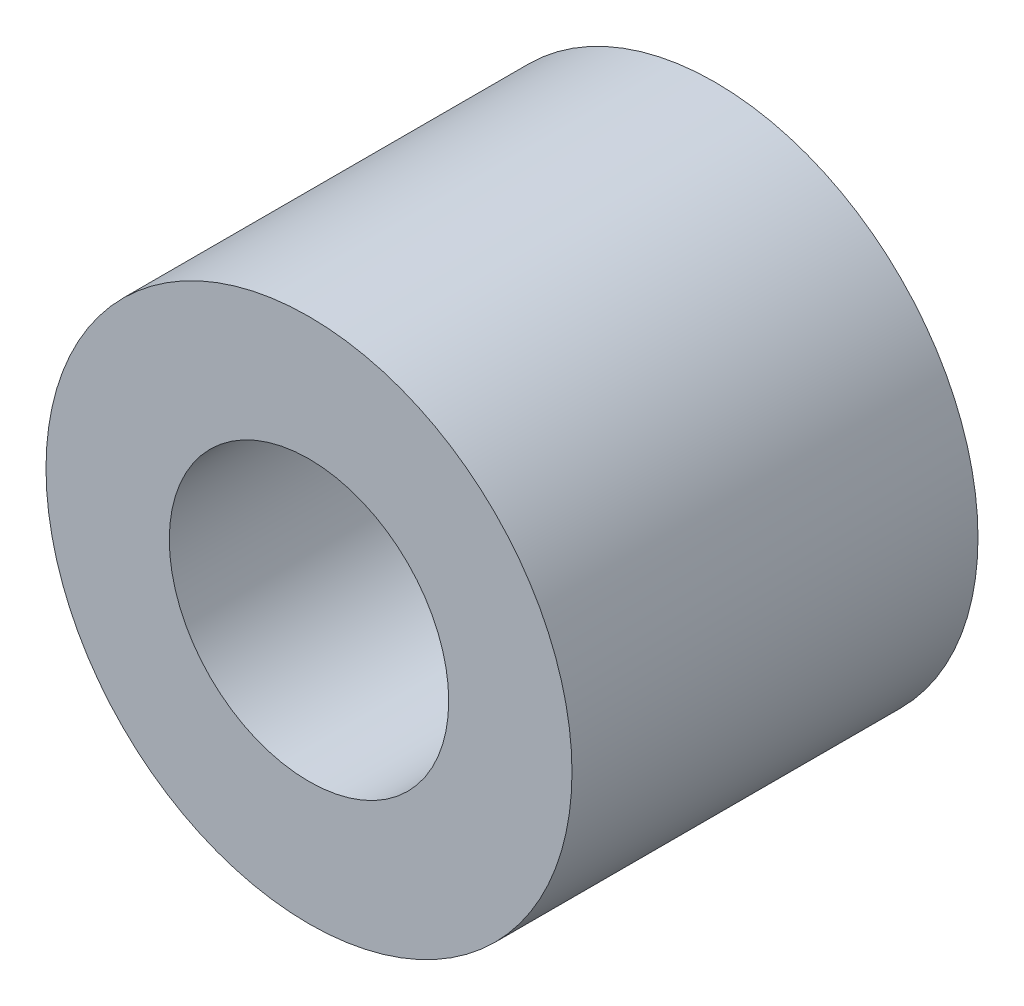
ISO-10303-21;
HEADER;
FILE_DESCRIPTION(('STEP AP214'),'2;1');
FILE_NAME('part.step','',(''),(''),'','','');
FILE_SCHEMA(('AUTOMOTIVE_DESIGN { 1 0 10303 214 1 1 1 1 }'));
ENDSEC;
DATA;
#1=APPLICATION_CONTEXT('core data for automotive mechanical design processes');
#2=APPLICATION_PROTOCOL_DEFINITION('international standard','automotive_design',2000,#1);
#3=PRODUCT_CONTEXT('',#1,'mechanical');
#4=PRODUCT('Part','Part','',(#3));
#5=PRODUCT_RELATED_PRODUCT_CATEGORY('part','',(#4));
#6=PRODUCT_DEFINITION_FORMATION('','',#4);
#7=PRODUCT_DEFINITION_CONTEXT('part definition',#1,'design');
#8=PRODUCT_DEFINITION('design','',#6,#7);
#9=PRODUCT_DEFINITION_SHAPE('','',#8);
#10=(LENGTH_UNIT() NAMED_UNIT(*) SI_UNIT(.MILLI.,.METRE.));
#11=(NAMED_UNIT(*) PLANE_ANGLE_UNIT() SI_UNIT($,.RADIAN.));
#12=(NAMED_UNIT(*) SI_UNIT($,.STERADIAN.) SOLID_ANGLE_UNIT());
#13=UNCERTAINTY_MEASURE_WITH_UNIT(LENGTH_MEASURE(1.E-05),#10,'distance_accuracy_value','');
#14=(GEOMETRIC_REPRESENTATION_CONTEXT(3) GLOBAL_UNCERTAINTY_ASSIGNED_CONTEXT((#13)) GLOBAL_UNIT_ASSIGNED_CONTEXT((#10,
#11,#12)) REPRESENTATION_CONTEXT('',''));
#15=CARTESIAN_POINT('',(0.,0.,0.));
#16=DIRECTION('',(0.,0.,1.));
#17=DIRECTION('',(1.,0.,0.));
#18=AXIS2_PLACEMENT_3D('',#15,#16,#17);
#19=CARTESIAN_POINT('',(0.,0.,12.35));
#20=DIRECTION('',(0.,0.,1.));
#21=DIRECTION('',(1.,0.,0.));
#22=AXIS2_PLACEMENT_3D('',#19,#20,#21);
#23=PLANE('',#22);
#24=CARTESIAN_POINT('',(0.,0.,12.35));
#25=DIRECTION('',(0.,0.,1.));
#26=DIRECTION('',(1.,0.,0.));
#27=AXIS2_PLACEMENT_3D('',#24,#25,#26);
#28=CIRCLE('',#27,8.);
#29=CARTESIAN_POINT('',(8.,0.,12.35));
#30=VERTEX_POINT('',#29);
#31=EDGE_CURVE('E10',#30,#30,#28,.T.);
#32=ORIENTED_EDGE('',*,*,#31,.T.);
#33=EDGE_LOOP('',(#32));
#34=FACE_BOUND('',#33,.T.);
#35=CARTESIAN_POINT('',(0.,0.,12.35));
#36=DIRECTION('',(0.,0.,1.));
#37=DIRECTION('',(1.,0.,0.));
#38=AXIS2_PLACEMENT_3D('',#35,#36,#37);
#39=CIRCLE('',#38,4.25);
#40=CARTESIAN_POINT('',(4.25,0.,12.35));
#41=VERTEX_POINT('',#40);
#42=EDGE_CURVE('E44',#41,#41,#39,.T.);
#43=ORIENTED_EDGE('',*,*,#42,.F.);
#44=EDGE_LOOP('',(#43));
#45=FACE_BOUND('',#44,.T.);
#46=ADVANCED_FACE('F33',(#34,#45),#23,.T.);
#47=CARTESIAN_POINT('',(0.,0.,0.));
#48=DIRECTION('',(0.,0.,1.));
#49=DIRECTION('',(1.,0.,0.));
#50=AXIS2_PLACEMENT_3D('',#47,#48,#49);
#51=PLANE('',#50);
#52=CARTESIAN_POINT('',(0.,0.,0.));
#53=DIRECTION('',(0.,0.,1.));
#54=DIRECTION('',(1.,0.,0.));
#55=AXIS2_PLACEMENT_3D('',#52,#53,#54);
#56=CIRCLE('',#55,8.);
#57=CARTESIAN_POINT('',(8.,0.,0.));
#58=VERTEX_POINT('',#57);
#59=EDGE_CURVE('E37',#58,#58,#56,.T.);
#60=ORIENTED_EDGE('',*,*,#59,.F.);
#61=EDGE_LOOP('',(#60));
#62=FACE_BOUND('',#61,.T.);
#63=CARTESIAN_POINT('',(0.,0.,0.));
#64=DIRECTION('',(0.,0.,1.));
#65=DIRECTION('',(1.,0.,0.));
#66=AXIS2_PLACEMENT_3D('',#63,#64,#65);
#67=CIRCLE('',#66,4.25);
#68=CARTESIAN_POINT('',(4.25,0.,0.));
#69=VERTEX_POINT('',#68);
#70=EDGE_CURVE('E46',#69,#69,#67,.T.);
#71=ORIENTED_EDGE('',*,*,#70,.T.);
#72=EDGE_LOOP('',(#71));
#73=FACE_BOUND('',#72,.T.);
#74=ADVANCED_FACE('F56',(#62,#73),#51,.F.);
#75=CARTESIAN_POINT('',(0.,0.,12.35));
#76=DIRECTION('',(0.,0.,-1.));
#77=DIRECTION('',(-1.,0.,0.));
#78=AXIS2_PLACEMENT_3D('',#75,#76,#77);
#79=CYLINDRICAL_SURFACE('',#78,8.);
#80=ORIENTED_EDGE('',*,*,#31,.F.);
#81=EDGE_LOOP('',(#80));
#82=FACE_BOUND('',#81,.T.);
#83=ORIENTED_EDGE('',*,*,#59,.T.);
#84=EDGE_LOOP('',(#83));
#85=FACE_BOUND('',#84,.T.);
#86=ADVANCED_FACE('F35',(#82,#85),#79,.T.);
#87=CARTESIAN_POINT('',(0.,0.,12.35));
#88=DIRECTION('',(0.,0.,-1.));
#89=DIRECTION('',(-1.,0.,0.));
#90=AXIS2_PLACEMENT_3D('',#87,#88,#89);
#91=CYLINDRICAL_SURFACE('',#90,4.25);
#92=ORIENTED_EDGE('',*,*,#42,.T.);
#93=EDGE_LOOP('',(#92));
#94=FACE_BOUND('',#93,.T.);
#95=ORIENTED_EDGE('',*,*,#70,.F.);
#96=EDGE_LOOP('',(#95));
#97=FACE_BOUND('',#96,.T.);
#98=ADVANCED_FACE('F52',(#94,#97),#91,.F.);
#99=CLOSED_SHELL('',(#46,#74,#86,#98));
#100=MANIFOLD_SOLID_BREP('B2',#99);
#101=ADVANCED_BREP_SHAPE_REPRESENTATION('',(#18,#100),#14);
#102=SHAPE_DEFINITION_REPRESENTATION(#9,#101);
ENDSEC;
END-ISO-10303-21;
